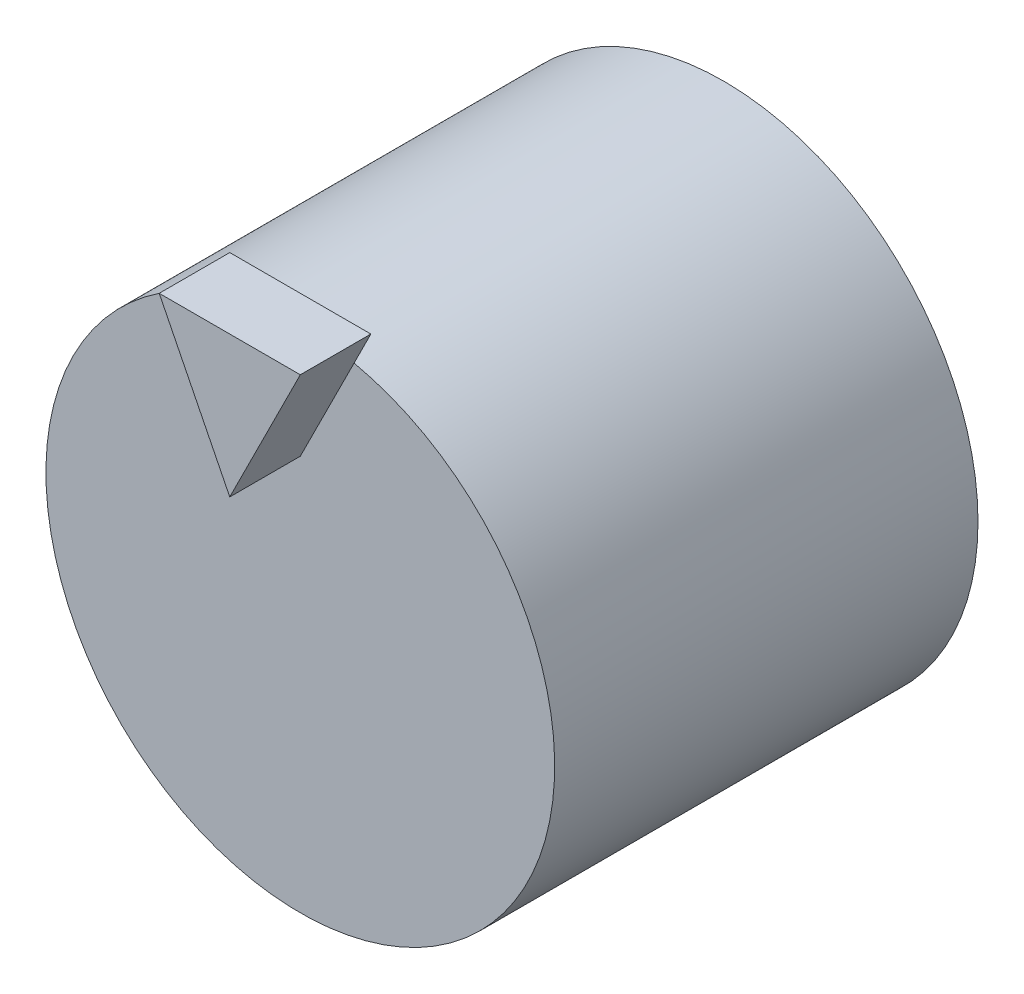
ISO-10303-21;
HEADER;
FILE_DESCRIPTION(('STEP AP214'),'2;1');
FILE_NAME('part.step','',(''),(''),'','','');
FILE_SCHEMA(('AUTOMOTIVE_DESIGN { 1 0 10303 214 1 1 1 1 }'));
ENDSEC;
DATA;
#1=APPLICATION_CONTEXT('core data for automotive mechanical design processes');
#2=APPLICATION_PROTOCOL_DEFINITION('international standard','automotive_design',2000,#1);
#3=PRODUCT_CONTEXT('',#1,'mechanical');
#4=PRODUCT('Part','Part','',(#3));
#5=PRODUCT_RELATED_PRODUCT_CATEGORY('part','',(#4));
#6=PRODUCT_DEFINITION_FORMATION('','',#4);
#7=PRODUCT_DEFINITION_CONTEXT('part definition',#1,'design');
#8=PRODUCT_DEFINITION('design','',#6,#7);
#9=PRODUCT_DEFINITION_SHAPE('','',#8);
#10=(LENGTH_UNIT() NAMED_UNIT(*) SI_UNIT(.MILLI.,.METRE.));
#11=(NAMED_UNIT(*) PLANE_ANGLE_UNIT() SI_UNIT($,.RADIAN.));
#12=(NAMED_UNIT(*) SI_UNIT($,.STERADIAN.) SOLID_ANGLE_UNIT());
#13=UNCERTAINTY_MEASURE_WITH_UNIT(LENGTH_MEASURE(1.E-05),#10,'distance_accuracy_value','');
#14=(GEOMETRIC_REPRESENTATION_CONTEXT(3) GLOBAL_UNCERTAINTY_ASSIGNED_CONTEXT((#13)) GLOBAL_UNIT_ASSIGNED_CONTEXT((#10,
#11,#12)) REPRESENTATION_CONTEXT('',''));
#15=CARTESIAN_POINT('',(0.,0.,0.));
#16=DIRECTION('',(0.,0.,1.));
#17=DIRECTION('',(1.,0.,0.));
#18=AXIS2_PLACEMENT_3D('',#15,#16,#17);
#19=CARTESIAN_POINT('',(0.,0.,60.));
#20=DIRECTION('',(0.,0.,-1.));
#21=DIRECTION('',(-1.,0.,0.));
#22=AXIS2_PLACEMENT_3D('',#19,#20,#21);
#23=CYLINDRICAL_SURFACE('',#22,36.0555127546399);
#24=CARTESIAN_POINT('',(0.,0.,60.));
#25=DIRECTION('',(0.,0.,1.));
#26=DIRECTION('',(1.,0.,0.));
#27=AXIS2_PLACEMENT_3D('',#24,#25,#26);
#28=CIRCLE('',#27,36.0555127546399);
#29=CARTESIAN_POINT('',(7.62049935181331,35.2409987036266,60.));
#30=VERTEX_POINT('',#29);
#31=CARTESIAN_POINT('',(-7.62049935181331,35.2409987036266,60.));
#32=VERTEX_POINT('',#31);
#33=EDGE_CURVE('E50',#30,#32,#28,.T.);
#34=ORIENTED_EDGE('',*,*,#33,.F.);
#35=EDGE_CURVE('E60',#32,#30,#28,.T.);
#36=ORIENTED_EDGE('',*,*,#35,.F.);
#37=EDGE_LOOP('',(#34,#36));
#38=FACE_BOUND('',#37,.T.);
#39=CARTESIAN_POINT('',(0.,0.,0.));
#40=DIRECTION('',(0.,0.,1.));
#41=DIRECTION('',(1.,0.,0.));
#42=AXIS2_PLACEMENT_3D('',#39,#40,#41);
#43=CIRCLE('',#42,36.0555127546399);
#44=CARTESIAN_POINT('',(36.0555127546399,0.,0.));
#45=VERTEX_POINT('',#44);
#46=EDGE_CURVE('E45',#45,#45,#43,.T.);
#47=ORIENTED_EDGE('',*,*,#46,.T.);
#48=EDGE_LOOP('',(#47));
#49=FACE_BOUND('',#48,.T.);
#50=ADVANCED_FACE('F39',(#38,#49),#23,.T.);
#51=CARTESIAN_POINT('',(0.,0.,60.));
#52=DIRECTION('',(0.,0.,1.));
#53=DIRECTION('',(1.,0.,0.));
#54=AXIS2_PLACEMENT_3D('',#51,#52,#53);
#55=PLANE('',#54);
#56=DIRECTION('',(0.447213595499958,0.894427190999916,0.));
#57=VECTOR('',#56,1.);
#58=CARTESIAN_POINT('',(0.,20.,60.));
#59=LINE('',#58,#57);
#60=CARTESIAN_POINT('',(0.,20.,60.));
#61=VERTEX_POINT('',#60);
#62=EDGE_CURVE('E100',#61,#30,#59,.T.);
#63=ORIENTED_EDGE('',*,*,#62,.F.);
#64=DIRECTION('',(0.447213595499958,-0.894427190999916,0.));
#65=VECTOR('',#64,1.);
#66=CARTESIAN_POINT('',(-10.,40.,60.));
#67=LINE('',#66,#65);
#68=EDGE_CURVE('E11',#32,#61,#67,.T.);
#69=ORIENTED_EDGE('',*,*,#68,.F.);
#70=ORIENTED_EDGE('',*,*,#35,.T.);
#71=EDGE_LOOP('',(#63,#69,#70));
#72=FACE_BOUND('',#71,.T.);
#73=ADVANCED_FACE('F120',(#72),#55,.T.);
#74=CARTESIAN_POINT('',(0.,0.,0.));
#75=DIRECTION('',(0.,0.,1.));
#76=DIRECTION('',(1.,0.,0.));
#77=AXIS2_PLACEMENT_3D('',#74,#75,#76);
#78=PLANE('',#77);
#79=ORIENTED_EDGE('',*,*,#46,.F.);
#80=EDGE_LOOP('',(#79));
#81=FACE_BOUND('',#80,.T.);
#82=ADVANCED_FACE('F121',(#81),#78,.F.);
#83=CARTESIAN_POINT('',(10.,40.,60.));
#84=DIRECTION('',(0.,0.,1.));
#85=DIRECTION('',(1.,0.,0.));
#86=AXIS2_PLACEMENT_3D('',#83,#84,#85);
#87=PLANE('',#86);
#88=CARTESIAN_POINT('',(10.,40.,60.));
#89=VERTEX_POINT('',#88);
#90=EDGE_CURVE('E112',#30,#89,#59,.T.);
#91=ORIENTED_EDGE('',*,*,#90,.F.);
#92=ORIENTED_EDGE('',*,*,#33,.T.);
#93=CARTESIAN_POINT('',(-10.,40.,60.));
#94=VERTEX_POINT('',#93);
#95=EDGE_CURVE('E47',#94,#32,#67,.T.);
#96=ORIENTED_EDGE('',*,*,#95,.F.);
#97=DIRECTION('',(-1.,0.,0.));
#98=VECTOR('',#97,1.);
#99=CARTESIAN_POINT('',(-10.,40.,60.));
#100=LINE('',#99,#98);
#101=EDGE_CURVE('E101',#89,#94,#100,.T.);
#102=ORIENTED_EDGE('',*,*,#101,.F.);
#103=EDGE_LOOP('',(#91,#92,#96,#102));
#104=FACE_BOUND('',#103,.T.);
#105=ADVANCED_FACE('F109',(#104),#87,.F.);
#106=CARTESIAN_POINT('',(-10.,40.,70.));
#107=DIRECTION('',(0.,-1.,0.));
#108=DIRECTION('',(0.,0.,-1.));
#109=AXIS2_PLACEMENT_3D('',#106,#107,#108);
#110=PLANE('',#109);
#111=ORIENTED_EDGE('',*,*,#101,.T.);
#112=DIRECTION('',(0.,0.,-1.));
#113=VECTOR('',#112,1.);
#114=CARTESIAN_POINT('',(-10.,40.,70.));
#115=LINE('',#114,#113);
#116=CARTESIAN_POINT('',(-10.,40.,70.));
#117=VERTEX_POINT('',#116);
#118=EDGE_CURVE('E84',#117,#94,#115,.T.);
#119=ORIENTED_EDGE('',*,*,#118,.F.);
#120=DIRECTION('',(-1.,0.,0.));
#121=VECTOR('',#120,1.);
#122=CARTESIAN_POINT('',(-10.,40.,70.));
#123=LINE('',#122,#121);
#124=CARTESIAN_POINT('',(10.,40.,70.));
#125=VERTEX_POINT('',#124);
#126=EDGE_CURVE('E89',#125,#117,#123,.T.);
#127=ORIENTED_EDGE('',*,*,#126,.F.);
#128=DIRECTION('',(0.,0.,-1.));
#129=VECTOR('',#128,1.);
#130=CARTESIAN_POINT('',(10.,40.,70.));
#131=LINE('',#130,#129);
#132=EDGE_CURVE('E102',#125,#89,#131,.T.);
#133=ORIENTED_EDGE('',*,*,#132,.T.);
#134=EDGE_LOOP('',(#111,#119,#127,#133));
#135=FACE_BOUND('',#134,.T.);
#136=ADVANCED_FACE('F97',(#135),#110,.F.);
#137=CARTESIAN_POINT('',(-10.,40.,70.));
#138=DIRECTION('',(0.894427190999916,0.447213595499958,0.));
#139=DIRECTION('',(-0.447213595499958,0.894427190999916,0.));
#140=AXIS2_PLACEMENT_3D('',#137,#138,#139);
#141=PLANE('',#140);
#142=ORIENTED_EDGE('',*,*,#95,.T.);
#143=ORIENTED_EDGE('',*,*,#68,.T.);
#144=DIRECTION('',(0.,0.,-1.));
#145=VECTOR('',#144,1.);
#146=CARTESIAN_POINT('',(0.,20.,70.));
#147=LINE('',#146,#145);
#148=CARTESIAN_POINT('',(0.,20.,70.));
#149=VERTEX_POINT('',#148);
#150=EDGE_CURVE('E88',#149,#61,#147,.T.);
#151=ORIENTED_EDGE('',*,*,#150,.F.);
#152=DIRECTION('',(0.447213595499958,-0.894427190999916,0.));
#153=VECTOR('',#152,1.);
#154=CARTESIAN_POINT('',(-10.,40.,70.));
#155=LINE('',#154,#153);
#156=EDGE_CURVE('E77',#117,#149,#155,.T.);
#157=ORIENTED_EDGE('',*,*,#156,.F.);
#158=ORIENTED_EDGE('',*,*,#118,.T.);
#159=EDGE_LOOP('',(#142,#143,#151,#157,#158));
#160=FACE_BOUND('',#159,.T.);
#161=ADVANCED_FACE('F81',(#160),#141,.F.);
#162=CARTESIAN_POINT('',(0.,20.,70.));
#163=DIRECTION('',(-0.894427190999916,0.447213595499958,0.));
#164=DIRECTION('',(-0.447213595499958,-0.894427190999916,0.));
#165=AXIS2_PLACEMENT_3D('',#162,#163,#164);
#166=PLANE('',#165);
#167=ORIENTED_EDGE('',*,*,#62,.T.);
#168=ORIENTED_EDGE('',*,*,#90,.T.);
#169=ORIENTED_EDGE('',*,*,#132,.F.);
#170=DIRECTION('',(0.447213595499958,0.894427190999916,0.));
#171=VECTOR('',#170,1.);
#172=CARTESIAN_POINT('',(0.,20.,70.));
#173=LINE('',#172,#171);
#174=EDGE_CURVE('E90',#149,#125,#173,.T.);
#175=ORIENTED_EDGE('',*,*,#174,.F.);
#176=ORIENTED_EDGE('',*,*,#150,.T.);
#177=EDGE_LOOP('',(#167,#168,#169,#175,#176));
#178=FACE_BOUND('',#177,.T.);
#179=ADVANCED_FACE('F117',(#178),#166,.F.);
#180=CARTESIAN_POINT('',(10.,40.,70.));
#181=DIRECTION('',(0.,0.,1.));
#182=DIRECTION('',(1.,0.,0.));
#183=AXIS2_PLACEMENT_3D('',#180,#181,#182);
#184=PLANE('',#183);
#185=ORIENTED_EDGE('',*,*,#126,.T.);
#186=ORIENTED_EDGE('',*,*,#156,.T.);
#187=ORIENTED_EDGE('',*,*,#174,.T.);
#188=EDGE_LOOP('',(#185,#186,#187));
#189=FACE_BOUND('',#188,.T.);
#190=ADVANCED_FACE('F91',(#189),#184,.T.);
#191=CLOSED_SHELL('',(#50,#73,#82,#105,#136,#161,#179,#190));
#192=MANIFOLD_SOLID_BREP('B2',#191);
#193=ADVANCED_BREP_SHAPE_REPRESENTATION('',(#18,#192),#14);
#194=SHAPE_DEFINITION_REPRESENTATION(#9,#193);
ENDSEC;
END-ISO-10303-21;
